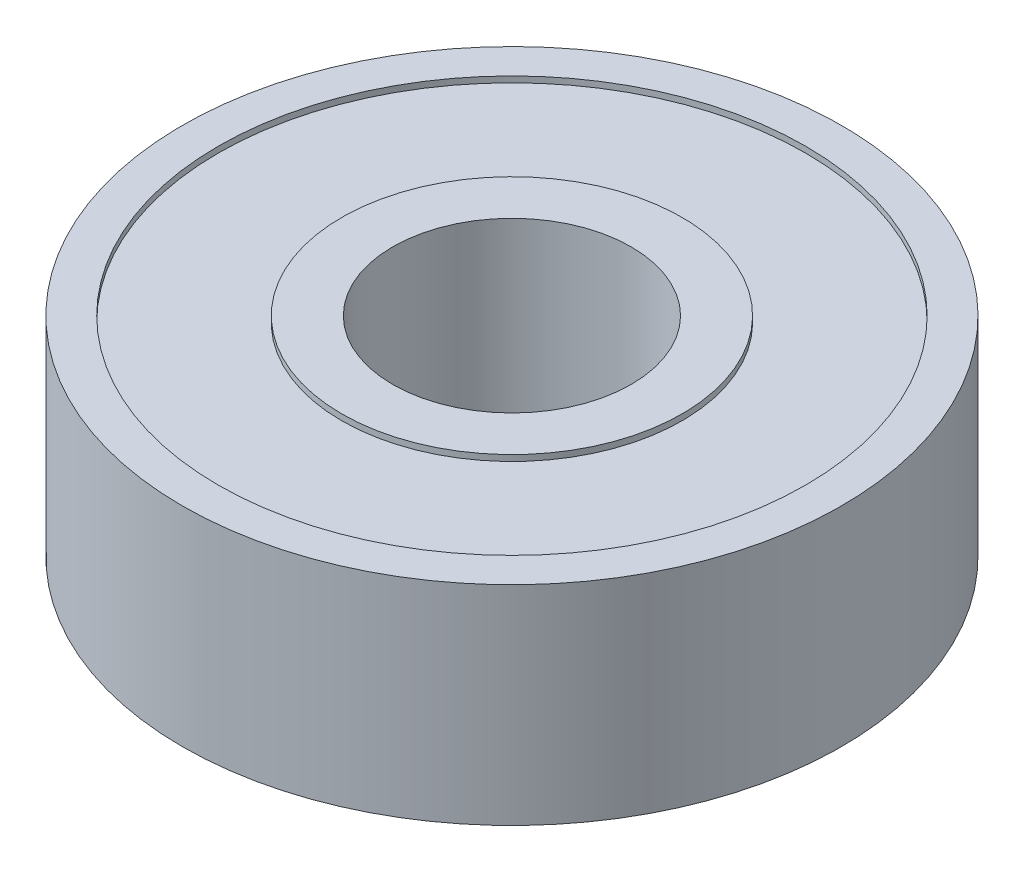
ISO-10303-21;
HEADER;
FILE_DESCRIPTION(('STEP AP214'),'2;1');
FILE_NAME('part.step','',(''),(''),'','','');
FILE_SCHEMA(('AUTOMOTIVE_DESIGN { 1 0 10303 214 1 1 1 1 }'));
ENDSEC;
DATA;
#1=APPLICATION_CONTEXT('core data for automotive mechanical design processes');
#2=APPLICATION_PROTOCOL_DEFINITION('international standard','automotive_design',2000,#1);
#3=PRODUCT_CONTEXT('',#1,'mechanical');
#4=PRODUCT('Part','Part','',(#3));
#5=PRODUCT_RELATED_PRODUCT_CATEGORY('part','',(#4));
#6=PRODUCT_DEFINITION_FORMATION('','',#4);
#7=PRODUCT_DEFINITION_CONTEXT('part definition',#1,'design');
#8=PRODUCT_DEFINITION('design','',#6,#7);
#9=PRODUCT_DEFINITION_SHAPE('','',#8);
#10=(LENGTH_UNIT() NAMED_UNIT(*) SI_UNIT(.MILLI.,.METRE.));
#11=(NAMED_UNIT(*) PLANE_ANGLE_UNIT() SI_UNIT($,.RADIAN.));
#12=(NAMED_UNIT(*) SI_UNIT($,.STERADIAN.) SOLID_ANGLE_UNIT());
#13=UNCERTAINTY_MEASURE_WITH_UNIT(LENGTH_MEASURE(1.E-05),#10,'distance_accuracy_value','');
#14=(GEOMETRIC_REPRESENTATION_CONTEXT(3) GLOBAL_UNCERTAINTY_ASSIGNED_CONTEXT((#13)) GLOBAL_UNIT_ASSIGNED_CONTEXT((#10,
#11,#12)) REPRESENTATION_CONTEXT('',''));
#15=CARTESIAN_POINT('',(0.,0.,0.));
#16=DIRECTION('',(0.,0.,1.));
#17=DIRECTION('',(1.,0.,0.));
#18=AXIS2_PLACEMENT_3D('',#15,#16,#17);
#19=CARTESIAN_POINT('',(0.,-3.48,0.));
#20=DIRECTION('',(0.,1.,0.));
#21=DIRECTION('',(0.,0.,1.));
#22=AXIS2_PLACEMENT_3D('',#19,#20,#21);
#23=PLANE('',#22);
#24=CARTESIAN_POINT('',(0.,-3.48,0.));
#25=DIRECTION('',(0.,1.,0.));
#26=DIRECTION('',(0.,0.,1.));
#27=AXIS2_PLACEMENT_3D('',#24,#25,#26);
#28=CIRCLE('',#27,3.98);
#29=CARTESIAN_POINT('',(0.,-3.48,3.98));
#30=VERTEX_POINT('',#29);
#31=EDGE_CURVE('E48',#30,#30,#28,.T.);
#32=ORIENTED_EDGE('',*,*,#31,.T.);
#33=EDGE_LOOP('',(#32));
#34=FACE_BOUND('',#33,.T.);
#35=CARTESIAN_POINT('',(0.,-3.48,0.));
#36=DIRECTION('',(0.,1.,0.));
#37=DIRECTION('',(0.,0.,1.));
#38=AXIS2_PLACEMENT_3D('',#35,#36,#37);
#39=CIRCLE('',#38,5.68);
#40=CARTESIAN_POINT('',(0.,-3.48,5.68));
#41=VERTEX_POINT('',#40);
#42=EDGE_CURVE('E72',#41,#41,#39,.T.);
#43=ORIENTED_EDGE('',*,*,#42,.F.);
#44=EDGE_LOOP('',(#43));
#45=FACE_BOUND('',#44,.T.);
#46=ADVANCED_FACE('F35',(#34,#45),#23,.F.);
#47=CARTESIAN_POINT('',(0.,3.48,0.));
#48=DIRECTION('',(0.,1.,0.));
#49=DIRECTION('',(0.,0.,1.));
#50=AXIS2_PLACEMENT_3D('',#47,#48,#49);
#51=PLANE('',#50);
#52=CARTESIAN_POINT('',(0.,3.48,0.));
#53=DIRECTION('',(0.,1.,0.));
#54=DIRECTION('',(0.,0.,1.));
#55=AXIS2_PLACEMENT_3D('',#52,#53,#54);
#56=CIRCLE('',#55,3.98);
#57=CARTESIAN_POINT('',(0.,3.48,3.98));
#58=VERTEX_POINT('',#57);
#59=EDGE_CURVE('E46',#58,#58,#56,.T.);
#60=ORIENTED_EDGE('',*,*,#59,.F.);
#61=EDGE_LOOP('',(#60));
#62=FACE_BOUND('',#61,.T.);
#63=CARTESIAN_POINT('',(0.,3.48,0.));
#64=DIRECTION('',(0.,1.,0.));
#65=DIRECTION('',(0.,0.,1.));
#66=AXIS2_PLACEMENT_3D('',#63,#64,#65);
#67=CIRCLE('',#66,5.68);
#68=CARTESIAN_POINT('',(0.,3.48,5.68));
#69=VERTEX_POINT('',#68);
#70=EDGE_CURVE('E60',#69,#69,#67,.T.);
#71=ORIENTED_EDGE('',*,*,#70,.T.);
#72=EDGE_LOOP('',(#71));
#73=FACE_BOUND('',#72,.T.);
#74=ADVANCED_FACE('F88',(#62,#73),#51,.T.);
#75=CARTESIAN_POINT('',(0.,3.48,0.));
#76=DIRECTION('',(0.,1.,0.));
#77=DIRECTION('',(0.,0.,1.));
#78=AXIS2_PLACEMENT_3D('',#75,#76,#77);
#79=CIRCLE('',#78,9.8);
#80=CARTESIAN_POINT('',(0.,3.48,9.8));
#81=VERTEX_POINT('',#80);
#82=EDGE_CURVE('E54',#81,#81,#79,.T.);
#83=ORIENTED_EDGE('',*,*,#82,.F.);
#84=EDGE_LOOP('',(#83));
#85=FACE_BOUND('',#84,.T.);
#86=CARTESIAN_POINT('',(0.,3.48,0.));
#87=DIRECTION('',(0.,1.,0.));
#88=DIRECTION('',(0.,0.,1.));
#89=AXIS2_PLACEMENT_3D('',#86,#87,#88);
#90=CIRCLE('',#89,11.);
#91=CARTESIAN_POINT('',(0.,3.48,11.));
#92=VERTEX_POINT('',#91);
#93=EDGE_CURVE('E10',#92,#92,#90,.T.);
#94=ORIENTED_EDGE('',*,*,#93,.T.);
#95=EDGE_LOOP('',(#94));
#96=FACE_BOUND('',#95,.T.);
#97=ADVANCED_FACE('F94',(#85,#96),#51,.T.);
#98=CARTESIAN_POINT('',(0.,-3.48,0.));
#99=DIRECTION('',(0.,1.,0.));
#100=DIRECTION('',(0.,0.,1.));
#101=AXIS2_PLACEMENT_3D('',#98,#99,#100);
#102=CIRCLE('',#101,9.8);
#103=CARTESIAN_POINT('',(0.,-3.48,9.8));
#104=VERTEX_POINT('',#103);
#105=EDGE_CURVE('E66',#104,#104,#102,.T.);
#106=ORIENTED_EDGE('',*,*,#105,.T.);
#107=EDGE_LOOP('',(#106));
#108=FACE_BOUND('',#107,.T.);
#109=CARTESIAN_POINT('',(0.,-3.48,0.));
#110=DIRECTION('',(0.,1.,0.));
#111=DIRECTION('',(0.,0.,1.));
#112=AXIS2_PLACEMENT_3D('',#109,#110,#111);
#113=CIRCLE('',#112,11.);
#114=CARTESIAN_POINT('',(0.,-3.48,11.));
#115=VERTEX_POINT('',#114);
#116=EDGE_CURVE('E39',#115,#115,#113,.T.);
#117=ORIENTED_EDGE('',*,*,#116,.F.);
#118=EDGE_LOOP('',(#117));
#119=FACE_BOUND('',#118,.T.);
#120=ADVANCED_FACE('F90',(#108,#119),#23,.F.);
#121=CARTESIAN_POINT('',(0.,3.48,0.));
#122=DIRECTION('',(0.,-1.,0.));
#123=DIRECTION('',(0.,0.,-1.));
#124=AXIS2_PLACEMENT_3D('',#121,#122,#123);
#125=CYLINDRICAL_SURFACE('',#124,11.);
#126=ORIENTED_EDGE('',*,*,#93,.F.);
#127=EDGE_LOOP('',(#126));
#128=FACE_BOUND('',#127,.T.);
#129=ORIENTED_EDGE('',*,*,#116,.T.);
#130=EDGE_LOOP('',(#129));
#131=FACE_BOUND('',#130,.T.);
#132=ADVANCED_FACE('F37',(#128,#131),#125,.T.);
#133=CARTESIAN_POINT('',(0.,3.48,0.));
#134=DIRECTION('',(0.,-1.,0.));
#135=DIRECTION('',(0.,0.,-1.));
#136=AXIS2_PLACEMENT_3D('',#133,#134,#135);
#137=CYLINDRICAL_SURFACE('',#136,3.98);
#138=ORIENTED_EDGE('',*,*,#59,.T.);
#139=EDGE_LOOP('',(#138));
#140=FACE_BOUND('',#139,.T.);
#141=ORIENTED_EDGE('',*,*,#31,.F.);
#142=EDGE_LOOP('',(#141));
#143=FACE_BOUND('',#142,.T.);
#144=ADVANCED_FACE('F103',(#140,#143),#137,.F.);
#145=CARTESIAN_POINT('',(0.,3.28,0.));
#146=DIRECTION('',(0.,1.,0.));
#147=DIRECTION('',(0.,0.,1.));
#148=AXIS2_PLACEMENT_3D('',#145,#146,#147);
#149=CYLINDRICAL_SURFACE('',#148,9.8);
#150=CARTESIAN_POINT('',(0.,3.28,0.));
#151=DIRECTION('',(0.,1.,0.));
#152=DIRECTION('',(0.,0.,1.));
#153=AXIS2_PLACEMENT_3D('',#150,#151,#152);
#154=CIRCLE('',#153,9.8);
#155=CARTESIAN_POINT('',(0.,3.28,9.8));
#156=VERTEX_POINT('',#155);
#157=EDGE_CURVE('E51',#156,#156,#154,.T.);
#158=ORIENTED_EDGE('',*,*,#157,.F.);
#159=EDGE_LOOP('',(#158));
#160=FACE_BOUND('',#159,.T.);
#161=ORIENTED_EDGE('',*,*,#82,.T.);
#162=EDGE_LOOP('',(#161));
#163=FACE_BOUND('',#162,.T.);
#164=ADVANCED_FACE('F127',(#160,#163),#149,.F.);
#165=CARTESIAN_POINT('',(0.,3.28,0.));
#166=DIRECTION('',(0.,1.,0.));
#167=DIRECTION('',(0.,0.,1.));
#168=AXIS2_PLACEMENT_3D('',#165,#166,#167);
#169=PLANE('',#168);
#170=CARTESIAN_POINT('',(0.,3.28,0.));
#171=DIRECTION('',(0.,1.,0.));
#172=DIRECTION('',(0.,0.,1.));
#173=AXIS2_PLACEMENT_3D('',#170,#171,#172);
#174=CIRCLE('',#173,5.68);
#175=CARTESIAN_POINT('',(0.,3.28,5.68));
#176=VERTEX_POINT('',#175);
#177=EDGE_CURVE('E57',#176,#176,#174,.T.);
#178=ORIENTED_EDGE('',*,*,#177,.F.);
#179=EDGE_LOOP('',(#178));
#180=FACE_BOUND('',#179,.T.);
#181=ORIENTED_EDGE('',*,*,#157,.T.);
#182=EDGE_LOOP('',(#181));
#183=FACE_BOUND('',#182,.T.);
#184=ADVANCED_FACE('F123',(#180,#183),#169,.T.);
#185=CARTESIAN_POINT('',(0.,3.28,0.));
#186=DIRECTION('',(0.,1.,0.));
#187=DIRECTION('',(0.,0.,1.));
#188=AXIS2_PLACEMENT_3D('',#185,#186,#187);
#189=CYLINDRICAL_SURFACE('',#188,5.68);
#190=ORIENTED_EDGE('',*,*,#177,.T.);
#191=EDGE_LOOP('',(#190));
#192=FACE_BOUND('',#191,.T.);
#193=ORIENTED_EDGE('',*,*,#70,.F.);
#194=EDGE_LOOP('',(#193));
#195=FACE_BOUND('',#194,.T.);
#196=ADVANCED_FACE('F117',(#192,#195),#189,.T.);
#197=CARTESIAN_POINT('',(0.,-3.28,0.));
#198=DIRECTION('',(0.,-1.,0.));
#199=DIRECTION('',(0.,0.,1.));
#200=AXIS2_PLACEMENT_3D('',#197,#198,#199);
#201=PLANE('',#200);
#202=CARTESIAN_POINT('',(0.,-3.28,0.));
#203=DIRECTION('',(0.,1.,0.));
#204=DIRECTION('',(0.,0.,1.));
#205=AXIS2_PLACEMENT_3D('',#202,#203,#204);
#206=CIRCLE('',#205,9.8);
#207=CARTESIAN_POINT('',(0.,-3.28,9.8));
#208=VERTEX_POINT('',#207);
#209=EDGE_CURVE('E63',#208,#208,#206,.T.);
#210=ORIENTED_EDGE('',*,*,#209,.F.);
#211=EDGE_LOOP('',(#210));
#212=FACE_BOUND('',#211,.T.);
#213=CARTESIAN_POINT('',(0.,-3.28,0.));
#214=DIRECTION('',(0.,1.,0.));
#215=DIRECTION('',(0.,0.,1.));
#216=AXIS2_PLACEMENT_3D('',#213,#214,#215);
#217=CIRCLE('',#216,5.68);
#218=CARTESIAN_POINT('',(0.,-3.28,5.68));
#219=VERTEX_POINT('',#218);
#220=EDGE_CURVE('E69',#219,#219,#217,.T.);
#221=ORIENTED_EDGE('',*,*,#220,.T.);
#222=EDGE_LOOP('',(#221));
#223=FACE_BOUND('',#222,.T.);
#224=ADVANCED_FACE('F78',(#212,#223),#201,.T.);
#225=CARTESIAN_POINT('',(0.,-3.28,0.));
#226=DIRECTION('',(0.,-1.,0.));
#227=DIRECTION('',(0.,0.,-1.));
#228=AXIS2_PLACEMENT_3D('',#225,#226,#227);
#229=CYLINDRICAL_SURFACE('',#228,9.8);
#230=ORIENTED_EDGE('',*,*,#209,.T.);
#231=EDGE_LOOP('',(#230));
#232=FACE_BOUND('',#231,.T.);
#233=ORIENTED_EDGE('',*,*,#105,.F.);
#234=EDGE_LOOP('',(#233));
#235=FACE_BOUND('',#234,.T.);
#236=ADVANCED_FACE('F83',(#232,#235),#229,.F.);
#237=CARTESIAN_POINT('',(0.,-3.28,0.));
#238=DIRECTION('',(0.,-1.,0.));
#239=DIRECTION('',(0.,0.,-1.));
#240=AXIS2_PLACEMENT_3D('',#237,#238,#239);
#241=CYLINDRICAL_SURFACE('',#240,5.68);
#242=ORIENTED_EDGE('',*,*,#220,.F.);
#243=EDGE_LOOP('',(#242));
#244=FACE_BOUND('',#243,.T.);
#245=ORIENTED_EDGE('',*,*,#42,.T.);
#246=EDGE_LOOP('',(#245));
#247=FACE_BOUND('',#246,.T.);
#248=ADVANCED_FACE('F80',(#244,#247),#241,.T.);
#249=CLOSED_SHELL('',(#46,#74,#97,#120,#132,#144,#164,#184,#196,#224,#236,#248));
#250=MANIFOLD_SOLID_BREP('B2',#249);
#251=ADVANCED_BREP_SHAPE_REPRESENTATION('',(#18,#250),#14);
#252=SHAPE_DEFINITION_REPRESENTATION(#9,#251);
ENDSEC;
END-ISO-10303-21;
